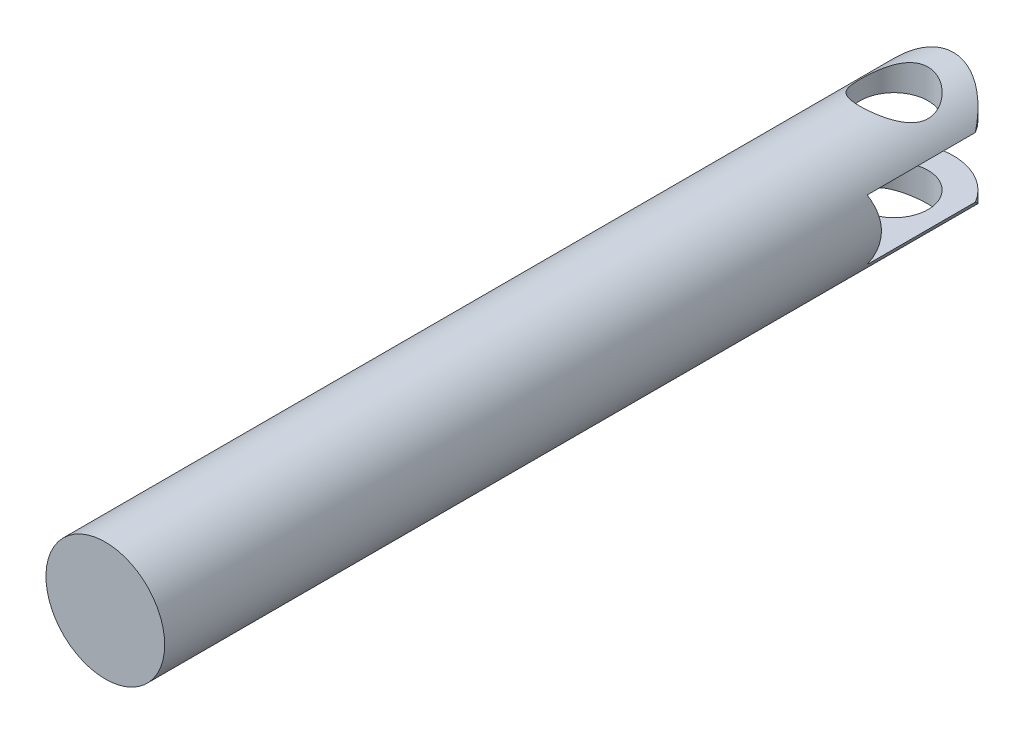
ISO-10303-21;
HEADER;
FILE_DESCRIPTION(('STEP AP214'),'2;1');
FILE_NAME('part.step','',(''),(''),'','','');
FILE_SCHEMA(('AUTOMOTIVE_DESIGN { 1 0 10303 214 1 1 1 1 }'));
ENDSEC;
DATA;
#1=APPLICATION_CONTEXT('core data for automotive mechanical design processes');
#2=APPLICATION_PROTOCOL_DEFINITION('international standard','automotive_design',2000,#1);
#3=PRODUCT_CONTEXT('',#1,'mechanical');
#4=PRODUCT('Part','Part','',(#3));
#5=PRODUCT_RELATED_PRODUCT_CATEGORY('part','',(#4));
#6=PRODUCT_DEFINITION_FORMATION('','',#4);
#7=PRODUCT_DEFINITION_CONTEXT('part definition',#1,'design');
#8=PRODUCT_DEFINITION('design','',#6,#7);
#9=PRODUCT_DEFINITION_SHAPE('','',#8);
#10=(LENGTH_UNIT() NAMED_UNIT(*) SI_UNIT(.MILLI.,.METRE.));
#11=(NAMED_UNIT(*) PLANE_ANGLE_UNIT() SI_UNIT($,.RADIAN.));
#12=(NAMED_UNIT(*) SI_UNIT($,.STERADIAN.) SOLID_ANGLE_UNIT());
#13=UNCERTAINTY_MEASURE_WITH_UNIT(LENGTH_MEASURE(1.E-05),#10,'distance_accuracy_value','');
#14=(GEOMETRIC_REPRESENTATION_CONTEXT(3) GLOBAL_UNCERTAINTY_ASSIGNED_CONTEXT((#13)) GLOBAL_UNIT_ASSIGNED_CONTEXT((#10,
#11,#12)) REPRESENTATION_CONTEXT('',''));
#15=CARTESIAN_POINT('',(0.,0.,0.));
#16=DIRECTION('',(0.,0.,1.));
#17=DIRECTION('',(1.,0.,0.));
#18=AXIS2_PLACEMENT_3D('',#15,#16,#17);
#19=CARTESIAN_POINT('',(0.,0.,100.));
#20=DIRECTION('',(0.,0.,-1.));
#21=DIRECTION('',(-1.,0.,0.));
#22=AXIS2_PLACEMENT_3D('',#19,#20,#21);
#23=CYLINDRICAL_SURFACE('',#22,7.);
#24=CARTESIAN_POINT('',(0.,-7.,11.01));
#25=CARTESIAN_POINT('',(0.10339422277203,-6.99999915490475,11.0099990606821));
#26=CARTESIAN_POINT('',(0.206819509013965,-6.99770306681074,11.0059946119519));
#27=CARTESIAN_POINT('',(0.412895896510924,-6.98857423742032,10.9900264503462));
#28=CARTESIAN_POINT('',(0.515546481284412,-6.98173870071603,10.9780578330995));
#29=CARTESIAN_POINT('',(0.719451117158006,-6.96368280476533,10.9462832091382));
#30=CARTESIAN_POINT('',(0.820702022515292,-6.95245384315522,10.9264618256769));
#31=CARTESIAN_POINT('',(1.02088525706655,-6.92589462898714,10.8792384189006));
#32=CARTESIAN_POINT('',(1.11981657821129,-6.91056262798031,10.8518331636622));
#33=CARTESIAN_POINT('',(1.41110752020608,-6.85910917687295,10.7590120418143));
#34=CARTESIAN_POINT('',(1.59917299541601,-6.81741679520293,10.682797926835));
#35=CARTESIAN_POINT('',(1.95923839934513,-6.72280876713762,10.5045596049174));
#36=CARTESIAN_POINT('',(2.13124264876945,-6.6698961517509,10.4025423669443));
#37=CARTESIAN_POINT('',(2.46853486559181,-6.55289468519645,10.1672864846148));
#38=CARTESIAN_POINT('',(2.63243314221602,-6.48827382698291,10.0323212106085));
#39=CARTESIAN_POINT('',(2.93661370542774,-6.35640279040988,9.73882402797849));
#40=CARTESIAN_POINT('',(3.0768677883393,-6.28914958822652,9.58026439347619));
#41=CARTESIAN_POINT('',(3.34529141750032,-6.15095126089987,9.22356832414636));
#42=CARTESIAN_POINT('',(3.47046225194872,-6.08040664798737,9.02300010893039));
#43=CARTESIAN_POINT('',(3.68477887626117,-5.95298539659239,8.59955768450985));
#44=CARTESIAN_POINT('',(3.77397940632616,-5.89608804336756,8.37671801826082));
#45=CARTESIAN_POINT('',(3.89648832700094,-5.8156261967934,7.96575766766011));
#46=CARTESIAN_POINT('',(3.93781282030795,-5.78746385411133,7.78092842520371));
#47=CARTESIAN_POINT('',(3.99393867809796,-5.74888383715326,7.40554464602105));
#48=CARTESIAN_POINT('',(4.00876868863763,-5.73844699851745,7.21499651961554));
#49=CARTESIAN_POINT('',(4.01108535441841,-5.73682821093372,6.83338960818927));
#50=CARTESIAN_POINT('',(3.99853394639673,-5.74567306570413,6.64233048153029));
#51=CARTESIAN_POINT('',(3.94675867786874,-5.78135278891646,6.26554993696892));
#52=CARTESIAN_POINT('',(3.90751637767286,-5.80820009436359,6.07983230180658));
#53=CARTESIAN_POINT('',(3.80452994791338,-5.87616304480329,5.7190902919182));
#54=CARTESIAN_POINT('',(3.74089100136453,-5.91721736513057,5.54402370009362));
#55=CARTESIAN_POINT('',(3.5913231225039,-6.00916666595751,5.206509256162));
#56=CARTESIAN_POINT('',(3.50538567846072,-6.06006540235207,5.04406625353967));
#57=CARTESIAN_POINT('',(3.29769841069949,-6.17587986838797,4.70866199713616));
#58=CARTESIAN_POINT('',(3.1724104337932,-6.24173300395297,4.53821770535939));
#59=CARTESIAN_POINT('',(2.89672203943336,-6.374353196614,4.21907011496009));
#60=CARTESIAN_POINT('',(2.74630007640611,-6.4411209923132,4.07038567641464));
#61=CARTESIAN_POINT('',(2.49437445829248,-6.54122019460662,3.85800438167936));
#62=CARTESIAN_POINT('',(2.40062015831315,-6.57629126704502,3.78578187780508));
#63=CARTESIAN_POINT('',(2.20649730699988,-6.64393825723827,3.64954991501123));
#64=CARTESIAN_POINT('',(2.10613145517799,-6.6765151817553,3.58553713511897));
#65=CARTESIAN_POINT('',(1.89930398153433,-6.73827095009801,3.46630577357821));
#66=CARTESIAN_POINT('',(1.79284216540309,-6.76744968551603,3.41108747246697));
#67=CARTESIAN_POINT('',(1.57455117673366,-6.82154078811034,3.3101034153821));
#68=CARTESIAN_POINT('',(1.46272531278859,-6.84645574298199,3.26433192262476));
#69=CARTESIAN_POINT('',(1.24230304302583,-6.88973312232274,3.18561575282503));
#70=CARTESIAN_POINT('',(1.13400862419864,-6.90842709502321,3.15200803066811));
#71=CARTESIAN_POINT('',(0.914320916944911,-6.94091751399438,3.09397713195957));
#72=CARTESIAN_POINT('',(0.802929336461923,-6.95471660399059,3.06954899708956));
#73=CARTESIAN_POINT('',(0.578014378075015,-6.97700958099427,3.03023616594795));
#74=CARTESIAN_POINT('',(0.464492271003925,-6.98550653316768,3.01534595566976));
#75=CARTESIAN_POINT('',(0.236316504527839,-6.9969420028122,2.99533197915777));
#76=CARTESIAN_POINT('',(0.121662974737821,-6.99988114971838,2.99020710697498));
#77=CARTESIAN_POINT('',(-0.0936232107450559,-7.00009772643698,2.98982972325072));
#78=CARTESIAN_POINT('',(-0.194255433725835,-6.998023721082,2.9934463044386));
#79=CARTESIAN_POINT('',(-0.394815898144512,-6.9895777518917,3.00821668297902));
#80=CARTESIAN_POINT('',(-0.494743909732402,-6.98320444498772,3.01937283563757));
#81=CARTESIAN_POINT('',(-0.693100062824907,-6.96631263283021,3.04908086480856));
#82=CARTESIAN_POINT('',(-0.791528774128059,-6.95579574531426,3.06762985504058));
#83=CARTESIAN_POINT('',(-0.986271026083983,-6.93086792483082,3.11189523080098));
#84=CARTESIAN_POINT('',(-1.08258373563265,-6.91645549035933,3.13761438012393));
#85=CARTESIAN_POINT('',(-1.36525924078058,-6.86820243886752,3.22446709062978));
#86=CARTESIAN_POINT('',(-1.54775511230006,-6.82912979981928,3.29566406792586));
#87=CARTESIAN_POINT('',(-1.89822120758769,-6.74014605650011,3.46239922617778));
#88=CARTESIAN_POINT('',(-2.06618795545145,-6.69023236862134,3.5579432103848));
#89=CARTESIAN_POINT('',(-2.40180770058298,-6.5776730331914,3.78189089067609));
#90=CARTESIAN_POINT('',(-2.56760643575879,-6.51424280257095,3.91268039655937));
#91=CARTESIAN_POINT('',(-2.87618247476918,-6.38401919282084,4.19787459929112));
#92=CARTESIAN_POINT('',(-3.0189329804026,-6.317222015622,4.35230638452663));
#93=CARTESIAN_POINT('',(-3.29374049282357,-6.17879392969487,4.70086489550501));
#94=CARTESIAN_POINT('',(-3.42278795740942,-6.10746458924374,4.89750275599001));
#95=CARTESIAN_POINT('',(-3.64570426607275,-5.97708825715025,5.31345803747138));
#96=CARTESIAN_POINT('',(-3.73961950995647,-5.91802511152271,5.53274505304236));
#97=CARTESIAN_POINT('',(-3.87198932670786,-5.83202821464702,5.94011559287066));
#98=CARTESIAN_POINT('',(-3.91800588922344,-5.80092616729374,6.12485730858766));
#99=CARTESIAN_POINT('',(-3.98339249397359,-5.75623193771265,6.50098702711298));
#100=CARTESIAN_POINT('',(-4.00279319368798,-5.74261961110047,6.6923671224296));
#101=CARTESIAN_POINT('',(-4.01388242754551,-5.73487628458108,7.07673866976633));
#102=CARTESIAN_POINT('',(-4.00551306786039,-5.740785983241,7.2697326503595));
#103=CARTESIAN_POINT('',(-3.96144763305538,-5.77127452469049,7.6511024301356));
#104=CARTESIAN_POINT('',(-3.92573431980416,-5.79586514419986,7.83947523870483));
#105=CARTESIAN_POINT('',(-3.8297627176397,-5.8597030128534,8.20323780898721));
#106=CARTESIAN_POINT('',(-3.76997561630966,-5.89866775970022,8.37880441455784));
#107=CARTESIAN_POINT('',(-3.62808562894618,-5.98698282534032,8.71782114304078));
#108=CARTESIAN_POINT('',(-3.54597455356914,-6.03633695387961,8.88126679143164));
#109=CARTESIAN_POINT('',(-3.34714426300905,-6.14911209394315,9.21825689586583));
#110=CARTESIAN_POINT('',(-3.22704117626925,-6.21352873084985,9.38947352075862));
#111=CARTESIAN_POINT('',(-2.96214477964389,-6.34409753197746,9.71095561311508));
#112=CARTESIAN_POINT('',(-2.81732985374759,-6.41025117236027,9.86120252692549));
#113=CARTESIAN_POINT('',(-2.4851725627203,-6.54675028575015,10.1558176386598));
#114=CARTESIAN_POINT('',(-2.29476860965261,-6.61656904913193,10.2970435968217));
#115=CARTESIAN_POINT('',(-1.99070876695479,-6.71181387593377,10.4830078876248));
#116=CARTESIAN_POINT('',(-1.88624212985324,-6.74199003029081,10.5406983776054));
#117=CARTESIAN_POINT('',(-1.67169043912192,-6.79836136300706,10.646896202529));
#118=CARTESIAN_POINT('',(-1.56160694241651,-6.82455763661813,10.6954060648607));
#119=CARTESIAN_POINT('',(-1.3566643432961,-6.86792592055508,10.7748382421832));
#120=CARTESIAN_POINT('',(-1.26258230643894,-6.88587425802628,10.8073541424068));
#121=CARTESIAN_POINT('',(-1.07169326140629,-6.91815260286331,10.8654261604258));
#122=CARTESIAN_POINT('',(-0.974886739237984,-6.93248325108001,10.8909835109474));
#123=CARTESIAN_POINT('',(-0.779392036648598,-6.95717139028924,10.934801180252));
#124=CARTESIAN_POINT('',(-0.680709035660352,-6.9675385100926,10.9530791876979));
#125=CARTESIAN_POINT('',(-0.481943976538681,-6.98410074785339,10.9821988781537));
#126=CARTESIAN_POINT('',(-0.381862735189229,-6.99029820539789,10.9930447313901));
#127=CARTESIAN_POINT('',(-0.234647357114613,-6.99622324796071,11.0034042191011));
#128=CARTESIAN_POINT('',(-0.187768256953036,-6.99763853006126,11.0058765443638));
#129=CARTESIAN_POINT('',(-0.0939282468051198,-6.99952715017047,11.0091747393046));
#130=CARTESIAN_POINT('',(-0.0469673283369137,-7.00000038388862,11.0100004266897));
#131=CARTESIAN_POINT('',(0.,-7.,11.01));
#132=B_SPLINE_CURVE_WITH_KNOTS('',3,(#24,#25,#26,#27,#28,#29,#30,#31,#32,#33,#34,#35,#36,#37,
#38,#39,#40,#41,#42,#43,#44,#45,#46,#47,#48,#49,#50,#51,#52,#53,#54,#55,#56,#57,#58,#59,#60,#61,
#62,#63,#64,#65,#66,#67,#68,#69,#70,#71,#72,#73,#74,#75,#76,#77,#78,#79,#80,#81,#82,#83,#84,#85,
#86,#87,#88,#89,#90,#91,#92,#93,#94,#95,#96,#97,#98,#99,#100,#101,#102,#103,#104,#105,#106,#107,
#108,#109,#110,#111,#112,#113,#114,#115,#116,#117,#118,#119,#120,#121,#122,#123,#124,#125,#126,
#127,#128,#129,#130,#131),.UNSPECIFIED.,.T.,.F.,(4,2,2,2,2,2,2,2,2,2,2,2,2,2,2,2,2,2,2,2,2,2,2,
2,2,2,2,2,2,2,2,2,2,2,2,2,2,2,2,2,2,2,2,2,2,2,2,2,2,2,2,2,2,4),(0.,0.310133634257097,
0.620458427174656,0.931393904189345,1.24246209327891,1.86095733878373,2.47928571774377,
3.14241678347418,3.80633334397143,4.54285213655744,5.27824581401167,5.85019188685847,
6.42151919171258,6.99364121203963,7.56615889102672,8.13623549933046,8.70653003692308,
9.36863811056312,10.0313167018104,10.4012158777616,10.7709649480745,11.1407258107439,
11.5102614629213,11.8545301286513,12.1986125707909,12.5424959141365,12.8863403095169,
13.1881256828158,13.4900053752235,13.7917673243063,14.0936457511264,14.6901902870958,
15.2868771461545,15.9457023877292,16.6052882140647,17.339074942203,18.0718890934378,
18.6481517061001,19.2237499918267,19.8005490134929,20.3777119595769,20.944088471665,
21.5106730347428,22.1646068796672,22.8191156954276,23.556334743082,23.9251889668221,
24.2939414983384,24.5970695876616,24.9001439420144,25.2024772709996,25.5046408197193,
25.645504937117,25.7863846481681),.UNSPECIFIED.);
#133=CARTESIAN_POINT('',(0.,-7.,11.01));
#134=VERTEX_POINT('',#133);
#135=EDGE_CURVE('E91',#134,#134,#132,.T.);
#136=ORIENTED_EDGE('',*,*,#135,.T.);
#137=EDGE_LOOP('',(#136));
#138=FACE_BOUND('',#137,.T.);
#139=CARTESIAN_POINT('',(0.,7.,11.01));
#140=CARTESIAN_POINT('',(-0.10339422277203,6.99999915490475,11.0099990606821));
#141=CARTESIAN_POINT('',(-0.206819509013965,6.99770306681074,11.0059946119519));
#142=CARTESIAN_POINT('',(-0.412895896510924,6.98857423742032,10.9900264503462));
#143=CARTESIAN_POINT('',(-0.515546481284412,6.98173870071603,10.9780578330995));
#144=CARTESIAN_POINT('',(-0.719451117158006,6.96368280476533,10.9462832091382));
#145=CARTESIAN_POINT('',(-0.820702022515292,6.95245384315522,10.9264618256769));
#146=CARTESIAN_POINT('',(-1.02088525706655,6.92589462898714,10.8792384189006));
#147=CARTESIAN_POINT('',(-1.11981657821129,6.91056262798031,10.8518331636622));
#148=CARTESIAN_POINT('',(-1.41110752020608,6.85910917687295,10.7590120418143));
#149=CARTESIAN_POINT('',(-1.59917299541601,6.81741679520293,10.682797926835));
#150=CARTESIAN_POINT('',(-1.95923839934513,6.72280876713762,10.5045596049174));
#151=CARTESIAN_POINT('',(-2.13124264876945,6.6698961517509,10.4025423669443));
#152=CARTESIAN_POINT('',(-2.46853486559181,6.55289468519645,10.1672864846148));
#153=CARTESIAN_POINT('',(-2.63243314221602,6.48827382698291,10.0323212106085));
#154=CARTESIAN_POINT('',(-2.93661370542774,6.35640279040988,9.73882402797849));
#155=CARTESIAN_POINT('',(-3.0768677883393,6.28914958822652,9.58026439347619));
#156=CARTESIAN_POINT('',(-3.34529141750032,6.15095126089987,9.22356832414636));
#157=CARTESIAN_POINT('',(-3.47046225194872,6.08040664798737,9.02300010893039));
#158=CARTESIAN_POINT('',(-3.68477887626117,5.95298539659239,8.59955768450985));
#159=CARTESIAN_POINT('',(-3.77397940632616,5.89608804336756,8.37671801826082));
#160=CARTESIAN_POINT('',(-3.89648832700094,5.8156261967934,7.96575766766011));
#161=CARTESIAN_POINT('',(-3.93781282030795,5.78746385411133,7.78092842520371));
#162=CARTESIAN_POINT('',(-3.99393867809796,5.74888383715326,7.40554464602105));
#163=CARTESIAN_POINT('',(-4.00876868863763,5.73844699851745,7.21499651961554));
#164=CARTESIAN_POINT('',(-4.01108535441841,5.73682821093372,6.83338960818927));
#165=CARTESIAN_POINT('',(-3.99853394639673,5.74567306570413,6.64233048153029));
#166=CARTESIAN_POINT('',(-3.94675867786874,5.78135278891646,6.26554993696892));
#167=CARTESIAN_POINT('',(-3.90751637767286,5.80820009436359,6.07983230180658));
#168=CARTESIAN_POINT('',(-3.80452994791338,5.87616304480329,5.7190902919182));
#169=CARTESIAN_POINT('',(-3.74089100136453,5.91721736513057,5.54402370009362));
#170=CARTESIAN_POINT('',(-3.5913231225039,6.00916666595751,5.206509256162));
#171=CARTESIAN_POINT('',(-3.50538567846072,6.06006540235207,5.04406625353967));
#172=CARTESIAN_POINT('',(-3.29769841069949,6.17587986838797,4.70866199713616));
#173=CARTESIAN_POINT('',(-3.1724104337932,6.24173300395297,4.53821770535939));
#174=CARTESIAN_POINT('',(-2.89672203943336,6.374353196614,4.21907011496009));
#175=CARTESIAN_POINT('',(-2.74630007640611,6.4411209923132,4.07038567641464));
#176=CARTESIAN_POINT('',(-2.49437445829248,6.54122019460662,3.85800438167936));
#177=CARTESIAN_POINT('',(-2.40062015831315,6.57629126704502,3.78578187780508));
#178=CARTESIAN_POINT('',(-2.20649730699988,6.64393825723827,3.64954991501123));
#179=CARTESIAN_POINT('',(-2.10613145517799,6.6765151817553,3.58553713511897));
#180=CARTESIAN_POINT('',(-1.89930398153433,6.73827095009801,3.46630577357821));
#181=CARTESIAN_POINT('',(-1.79284216540309,6.76744968551603,3.41108747246697));
#182=CARTESIAN_POINT('',(-1.57455117673366,6.82154078811034,3.3101034153821));
#183=CARTESIAN_POINT('',(-1.46272531278859,6.84645574298199,3.26433192262476));
#184=CARTESIAN_POINT('',(-1.24230304302583,6.88973312232274,3.18561575282503));
#185=CARTESIAN_POINT('',(-1.13400862419864,6.90842709502321,3.15200803066811));
#186=CARTESIAN_POINT('',(-0.914320916944911,6.94091751399438,3.09397713195957));
#187=CARTESIAN_POINT('',(-0.802929336461923,6.95471660399059,3.06954899708956));
#188=CARTESIAN_POINT('',(-0.578014378075015,6.97700958099427,3.03023616594795));
#189=CARTESIAN_POINT('',(-0.464492271003925,6.98550653316768,3.01534595566976));
#190=CARTESIAN_POINT('',(-0.236316504527839,6.9969420028122,2.99533197915777));
#191=CARTESIAN_POINT('',(-0.121662974737821,6.99988114971838,2.99020710697498));
#192=CARTESIAN_POINT('',(0.0936232107450559,7.00009772643698,2.98982972325072));
#193=CARTESIAN_POINT('',(0.194255433725835,6.998023721082,2.9934463044386));
#194=CARTESIAN_POINT('',(0.394815898144512,6.9895777518917,3.00821668297902));
#195=CARTESIAN_POINT('',(0.494743909732402,6.98320444498772,3.01937283563757));
#196=CARTESIAN_POINT('',(0.693100062824907,6.96631263283021,3.04908086480856));
#197=CARTESIAN_POINT('',(0.791528774128059,6.95579574531426,3.06762985504058));
#198=CARTESIAN_POINT('',(0.986271026083983,6.93086792483082,3.11189523080098));
#199=CARTESIAN_POINT('',(1.08258373563265,6.91645549035933,3.13761438012393));
#200=CARTESIAN_POINT('',(1.36525924078058,6.86820243886752,3.22446709062978));
#201=CARTESIAN_POINT('',(1.54775511230006,6.82912979981928,3.29566406792586));
#202=CARTESIAN_POINT('',(1.89822120758769,6.74014605650011,3.46239922617778));
#203=CARTESIAN_POINT('',(2.06618795545145,6.69023236862134,3.5579432103848));
#204=CARTESIAN_POINT('',(2.40180770058298,6.5776730331914,3.78189089067609));
#205=CARTESIAN_POINT('',(2.56760643575879,6.51424280257095,3.91268039655937));
#206=CARTESIAN_POINT('',(2.87618247476918,6.38401919282084,4.19787459929112));
#207=CARTESIAN_POINT('',(3.0189329804026,6.317222015622,4.35230638452663));
#208=CARTESIAN_POINT('',(3.29374049282357,6.17879392969487,4.70086489550501));
#209=CARTESIAN_POINT('',(3.42278795740942,6.10746458924374,4.89750275599001));
#210=CARTESIAN_POINT('',(3.64570426607275,5.97708825715025,5.31345803747138));
#211=CARTESIAN_POINT('',(3.73961950995647,5.91802511152271,5.53274505304236));
#212=CARTESIAN_POINT('',(3.87198932670786,5.83202821464702,5.94011559287066));
#213=CARTESIAN_POINT('',(3.91800588922344,5.80092616729374,6.12485730858766));
#214=CARTESIAN_POINT('',(3.98339249397359,5.75623193771265,6.50098702711298));
#215=CARTESIAN_POINT('',(4.00279319368798,5.74261961110047,6.6923671224296));
#216=CARTESIAN_POINT('',(4.01388242754551,5.73487628458108,7.07673866976633));
#217=CARTESIAN_POINT('',(4.00551306786039,5.740785983241,7.2697326503595));
#218=CARTESIAN_POINT('',(3.96144763305538,5.77127452469049,7.6511024301356));
#219=CARTESIAN_POINT('',(3.92573431980416,5.79586514419986,7.83947523870483));
#220=CARTESIAN_POINT('',(3.8297627176397,5.8597030128534,8.20323780898721));
#221=CARTESIAN_POINT('',(3.76997561630966,5.89866775970022,8.37880441455784));
#222=CARTESIAN_POINT('',(3.62808562894618,5.98698282534032,8.71782114304078));
#223=CARTESIAN_POINT('',(3.54597455356914,6.03633695387961,8.88126679143164));
#224=CARTESIAN_POINT('',(3.34714426300905,6.14911209394315,9.21825689586583));
#225=CARTESIAN_POINT('',(3.22704117626925,6.21352873084985,9.38947352075862));
#226=CARTESIAN_POINT('',(2.96214477964389,6.34409753197746,9.71095561311508));
#227=CARTESIAN_POINT('',(2.81732985374759,6.41025117236027,9.86120252692549));
#228=CARTESIAN_POINT('',(2.4851725627203,6.54675028575015,10.1558176386598));
#229=CARTESIAN_POINT('',(2.29476860965261,6.61656904913193,10.2970435968217));
#230=CARTESIAN_POINT('',(1.99070876695479,6.71181387593377,10.4830078876248));
#231=CARTESIAN_POINT('',(1.88624212985324,6.74199003029081,10.5406983776054));
#232=CARTESIAN_POINT('',(1.67169043912192,6.79836136300706,10.646896202529));
#233=CARTESIAN_POINT('',(1.56160694241651,6.82455763661813,10.6954060648607));
#234=CARTESIAN_POINT('',(1.3566643432961,6.86792592055508,10.7748382421832));
#235=CARTESIAN_POINT('',(1.26258230643894,6.88587425802628,10.8073541424068));
#236=CARTESIAN_POINT('',(1.07169326140629,6.91815260286331,10.8654261604258));
#237=CARTESIAN_POINT('',(0.974886739237984,6.93248325108001,10.8909835109474));
#238=CARTESIAN_POINT('',(0.779392036648598,6.95717139028924,10.934801180252));
#239=CARTESIAN_POINT('',(0.680709035660352,6.9675385100926,10.9530791876979));
#240=CARTESIAN_POINT('',(0.481943976538681,6.98410074785339,10.9821988781537));
#241=CARTESIAN_POINT('',(0.381862735189229,6.99029820539789,10.9930447313901));
#242=CARTESIAN_POINT('',(0.234647357114613,6.99622324796071,11.0034042191011));
#243=CARTESIAN_POINT('',(0.187768256953036,6.99763853006126,11.0058765443638));
#244=CARTESIAN_POINT('',(0.0939282468051198,6.99952715017047,11.0091747393046));
#245=CARTESIAN_POINT('',(0.0469673283369137,7.00000038388862,11.0100004266897));
#246=CARTESIAN_POINT('',(0.,7.,11.01));
#247=B_SPLINE_CURVE_WITH_KNOTS('',3,(#139,#140,#141,#142,#143,#144,#145,#146,#147,#148,#149,
#150,#151,#152,#153,#154,#155,#156,#157,#158,#159,#160,#161,#162,#163,#164,#165,#166,#167,#168,
#169,#170,#171,#172,#173,#174,#175,#176,#177,#178,#179,#180,#181,#182,#183,#184,#185,#186,#187,
#188,#189,#190,#191,#192,#193,#194,#195,#196,#197,#198,#199,#200,#201,#202,#203,#204,#205,#206,
#207,#208,#209,#210,#211,#212,#213,#214,#215,#216,#217,#218,#219,#220,#221,#222,#223,#224,#225,
#226,#227,#228,#229,#230,#231,#232,#233,#234,#235,#236,#237,#238,#239,#240,#241,#242,#243,#244,
#245,#246),.UNSPECIFIED.,.T.,.F.,(4,2,2,2,2,2,2,2,2,2,2,2,2,2,2,2,2,2,2,2,2,2,2,2,2,2,2,2,2,2,2,
2,2,2,2,2,2,2,2,2,2,2,2,2,2,2,2,2,2,2,2,2,2,4),(0.,0.310133634257097,0.620458427174656,
0.931393904189345,1.24246209327891,1.86095733878373,2.47928571774377,3.14241678347418,
3.80633334397143,4.54285213655744,5.27824581401167,5.85019188685847,6.42151919171258,
6.99364121203963,7.56615889102672,8.13623549933046,8.70653003692308,9.36863811056312,
10.0313167018104,10.4012158777616,10.7709649480745,11.1407258107439,11.5102614629213,
11.8545301286513,12.1986125707909,12.5424959141365,12.8863403095169,13.1881256828158,
13.4900053752235,13.7917673243063,14.0936457511264,14.6901902870958,15.2868771461545,
15.9457023877292,16.6052882140647,17.339074942203,18.0718890934378,18.6481517061001,
19.2237499918267,19.8005490134929,20.3777119595769,20.944088471665,21.5106730347428,
22.1646068796672,22.8191156954276,23.556334743082,23.9251889668221,24.2939414983384,
24.5970695876616,24.9001439420144,25.2024772709996,25.5046408197193,25.645504937117,
25.7863846481681),.UNSPECIFIED.);
#248=CARTESIAN_POINT('',(0.,7.,11.01));
#249=VERTEX_POINT('',#248);
#250=EDGE_CURVE('E146',#249,#249,#247,.T.);
#251=ORIENTED_EDGE('',*,*,#250,.T.);
#252=EDGE_LOOP('',(#251));
#253=FACE_BOUND('',#252,.T.);
#254=CARTESIAN_POINT('',(0.,0.,100.));
#255=DIRECTION('',(0.,0.,1.));
#256=DIRECTION('',(1.,0.,0.));
#257=AXIS2_PLACEMENT_3D('',#254,#255,#256);
#258=CIRCLE('',#257,7.);
#259=CARTESIAN_POINT('',(7.,0.,100.));
#260=VERTEX_POINT('',#259);
#261=EDGE_CURVE('E102',#260,#260,#258,.T.);
#262=ORIENTED_EDGE('',*,*,#261,.F.);
#263=EDGE_LOOP('',(#262));
#264=FACE_BOUND('',#263,.T.);
#265=DIRECTION('',(0.,0.,-1.));
#266=VECTOR('',#265,1.);
#267=CARTESIAN_POINT('',(6.03303406255923,-3.55,100.));
#268=LINE('',#267,#266);
#269=CARTESIAN_POINT('',(6.03303406255923,-3.55,16.1979617307314));
#270=VERTEX_POINT('',#269);
#271=CARTESIAN_POINT('',(6.03303406255924,-3.55,3.45));
#272=VERTEX_POINT('',#271);
#273=EDGE_CURVE('E58',#270,#272,#268,.T.);
#274=ORIENTED_EDGE('',*,*,#273,.F.);
#275=CARTESIAN_POINT('',(6.03303406255923,-3.55,16.1979617307314));
#276=CARTESIAN_POINT('',(6.11702957575485,-3.40724880263015,16.1428724182977));
#277=CARTESIAN_POINT('',(6.19623973289976,-3.26104781235698,16.089267074652));
#278=CARTESIAN_POINT('',(6.34463370903779,-2.96201360204328,15.9863101857787));
#279=CARTESIAN_POINT('',(6.41380754926322,-2.80917397492292,15.9369628936718));
#280=CARTESIAN_POINT('',(6.54197302515412,-2.49627144262936,15.8435812531352));
#281=CARTESIAN_POINT('',(6.60088635286948,-2.33616382242555,15.7995884761049));
#282=CARTESIAN_POINT('',(6.70726922871005,-2.01044347743437,15.7187731773768));
#283=CARTESIAN_POINT('',(6.75474096377491,-1.84483181158431,15.6819492856813));
#284=CARTESIAN_POINT('',(6.8379034542539,-1.50778195255008,15.6166060867518));
#285=CARTESIAN_POINT('',(6.87351018021311,-1.33631130452845,15.5881461748908));
#286=CARTESIAN_POINT('',(6.93188897820128,-0.989834451092231,15.5410964845965));
#287=CARTESIAN_POINT('',(6.95466049951405,-0.814828094305745,15.5225071296781));
#288=CARTESIAN_POINT('',(6.98684850482661,-0.463580038113813,15.4961393103621));
#289=CARTESIAN_POINT('',(6.9963253337604,-0.287347593545877,15.4883120000271));
#290=CARTESIAN_POINT('',(7.00191621535575,0.065461283180805,15.4837012445256));
#291=CARTESIAN_POINT('',(6.99803192860926,0.24203766986641,15.4869164269382));
#292=CARTESIAN_POINT('',(6.97820378774863,0.573586359135738,15.5032231044626));
#293=CARTESIAN_POINT('',(6.96369899691792,0.728706670344038,15.5151356116501));
#294=CARTESIAN_POINT('',(6.92452367839862,1.03687281630774,15.5470234233945));
#295=CARTESIAN_POINT('',(6.89984935234136,1.1899178538539,15.5670017405117));
#296=CARTESIAN_POINT('',(6.84060253201946,1.49336040719144,15.6143830114673));
#297=CARTESIAN_POINT('',(6.80600202478728,1.6437491331369,15.6418069659478));
#298=CARTESIAN_POINT('',(6.7273543517269,1.9406985501163,15.7031711312086));
#299=CARTESIAN_POINT('',(6.68330443175924,2.08725811109574,15.7371132414772));
#300=CARTESIAN_POINT('',(6.55635375856137,2.46468673662445,15.8331130075575));
#301=CARTESIAN_POINT('',(6.4662152575242,2.69200663477552,15.899628653111));
#302=CARTESIAN_POINT('',(6.26491087597459,3.13194640870477,16.0424567333448));
#303=CARTESIAN_POINT('',(6.15388954810585,3.34465437250946,16.1187007249173));
#304=CARTESIAN_POINT('',(6.03303406255923,3.55,16.1979617307314));
#305=B_SPLINE_CURVE_WITH_KNOTS('',3,(#275,#276,#277,#278,#279,#280,#281,#282,#283,#284,#285,
#286,#287,#288,#289,#290,#291,#292,#293,#294,#295,#296,#297,#298,#299,#300,#301,#302,#303,#304),
.UNSPECIFIED.,.F.,.F.,(4,2,2,2,2,2,2,2,2,2,2,2,2,2,4),(0.,0.523622513341592,1.0477621304742,
1.57574161974169,2.10362011112844,2.63516135982999,3.16672541347265,3.695868791095,
4.22494640628436,4.69314564908993,5.16151992519403,5.63122924104731,6.10107564551628,
6.85971602828546,7.61328638813762),.UNSPECIFIED.);
#306=CARTESIAN_POINT('',(6.03303406255923,3.55,16.1979617307314));
#307=VERTEX_POINT('',#306);
#308=EDGE_CURVE('E12',#270,#307,#305,.T.);
#309=ORIENTED_EDGE('',*,*,#308,.T.);
#310=DIRECTION('',(0.,0.,-1.));
#311=VECTOR('',#310,1.);
#312=CARTESIAN_POINT('',(6.03303406255923,3.55,100.));
#313=LINE('',#312,#311);
#314=CARTESIAN_POINT('',(6.03303406255924,3.55,3.45));
#315=VERTEX_POINT('',#314);
#316=EDGE_CURVE('E76',#307,#315,#313,.T.);
#317=ORIENTED_EDGE('',*,*,#316,.T.);
#318=CARTESIAN_POINT('',(0.,0.,7.));
#319=DIRECTION('',(0.,-0.707106781186547,-0.707106781186547));
#320=DIRECTION('',(0.,0.707106781186547,-0.707106781186547));
#321=AXIS2_PLACEMENT_3D('',#318,#319,#320);
#322=ELLIPSE('',#321,9.89949493661166,7.);
#323=CARTESIAN_POINT('',(-6.03303406255924,3.55,3.45));
#324=VERTEX_POINT('',#323);
#325=EDGE_CURVE('E98',#324,#315,#322,.T.);
#326=ORIENTED_EDGE('',*,*,#325,.F.);
#327=DIRECTION('',(0.,0.,-1.));
#328=VECTOR('',#327,1.);
#329=CARTESIAN_POINT('',(-6.03303406255923,3.55,100.));
#330=LINE('',#329,#328);
#331=CARTESIAN_POINT('',(-6.03303406255923,3.55,16.1979617307314));
#332=VERTEX_POINT('',#331);
#333=EDGE_CURVE('E50',#324,#332,#330,.F.);
#334=ORIENTED_EDGE('',*,*,#333,.T.);
#335=CARTESIAN_POINT('',(-6.03303406255923,3.55,16.1979617307314));
#336=CARTESIAN_POINT('',(-6.11702957575485,3.40724880263015,16.1428724182977));
#337=CARTESIAN_POINT('',(-6.19623973289976,3.26104781235698,16.089267074652));
#338=CARTESIAN_POINT('',(-6.34463370903779,2.96201360204328,15.9863101857787));
#339=CARTESIAN_POINT('',(-6.41380754926322,2.80917397492292,15.9369628936718));
#340=CARTESIAN_POINT('',(-6.54197302515412,2.49627144262936,15.8435812531352));
#341=CARTESIAN_POINT('',(-6.60088635286948,2.33616382242555,15.7995884761049));
#342=CARTESIAN_POINT('',(-6.70726922871005,2.01044347743437,15.7187731773768));
#343=CARTESIAN_POINT('',(-6.75474096377491,1.84483181158431,15.6819492856813));
#344=CARTESIAN_POINT('',(-6.8379034542539,1.50778195255008,15.6166060867518));
#345=CARTESIAN_POINT('',(-6.87351018021311,1.33631130452845,15.5881461748908));
#346=CARTESIAN_POINT('',(-6.93188897820128,0.989834451092231,15.5410964845965));
#347=CARTESIAN_POINT('',(-6.95466049951405,0.814828094305745,15.5225071296781));
#348=CARTESIAN_POINT('',(-6.98684850482661,0.463580038113813,15.4961393103621));
#349=CARTESIAN_POINT('',(-6.9963253337604,0.287347593545877,15.4883120000271));
#350=CARTESIAN_POINT('',(-7.00191621535575,-0.065461283180805,15.4837012445256));
#351=CARTESIAN_POINT('',(-6.99803192860926,-0.24203766986641,15.4869164269382));
#352=CARTESIAN_POINT('',(-6.97820378774863,-0.573586359135738,15.5032231044626));
#353=CARTESIAN_POINT('',(-6.96369899691792,-0.728706670344038,15.5151356116501));
#354=CARTESIAN_POINT('',(-6.92452367839862,-1.03687281630774,15.5470234233945));
#355=CARTESIAN_POINT('',(-6.89984935234136,-1.1899178538539,15.5670017405117));
#356=CARTESIAN_POINT('',(-6.84060253201946,-1.49336040719144,15.6143830114673));
#357=CARTESIAN_POINT('',(-6.80600202478728,-1.6437491331369,15.6418069659478));
#358=CARTESIAN_POINT('',(-6.7273543517269,-1.9406985501163,15.7031711312086));
#359=CARTESIAN_POINT('',(-6.68330443175924,-2.08725811109574,15.7371132414772));
#360=CARTESIAN_POINT('',(-6.55635375856137,-2.46468673662445,15.8331130075575));
#361=CARTESIAN_POINT('',(-6.4662152575242,-2.69200663477552,15.899628653111));
#362=CARTESIAN_POINT('',(-6.26491087597459,-3.13194640870477,16.0424567333448));
#363=CARTESIAN_POINT('',(-6.15388954810585,-3.34465437250946,16.1187007249173));
#364=CARTESIAN_POINT('',(-6.03303406255923,-3.55,16.1979617307314));
#365=B_SPLINE_CURVE_WITH_KNOTS('',3,(#335,#336,#337,#338,#339,#340,#341,#342,#343,#344,#345,
#346,#347,#348,#349,#350,#351,#352,#353,#354,#355,#356,#357,#358,#359,#360,#361,#362,#363,#364),
.UNSPECIFIED.,.F.,.F.,(4,2,2,2,2,2,2,2,2,2,2,2,2,2,4),(0.,0.523622513341592,1.0477621304742,
1.57574161974169,2.10362011112844,2.63516135982999,3.16672541347265,3.695868791095,
4.22494640628436,4.69314564908993,5.16151992519403,5.63122924104731,6.10107564551628,
6.85971602828546,7.61328638813762),.UNSPECIFIED.);
#366=CARTESIAN_POINT('',(-6.03303406255923,-3.55,16.1979617307314));
#367=VERTEX_POINT('',#366);
#368=EDGE_CURVE('E43',#332,#367,#365,.T.);
#369=ORIENTED_EDGE('',*,*,#368,.T.);
#370=DIRECTION('',(0.,0.,-1.));
#371=VECTOR('',#370,1.);
#372=CARTESIAN_POINT('',(-6.03303406255923,-3.55,100.));
#373=LINE('',#372,#371);
#374=CARTESIAN_POINT('',(-6.03303406255924,-3.55,3.45));
#375=VERTEX_POINT('',#374);
#376=EDGE_CURVE('E84',#375,#367,#373,.F.);
#377=ORIENTED_EDGE('',*,*,#376,.F.);
#378=CARTESIAN_POINT('',(0.,0.,7.));
#379=DIRECTION('',(0.,0.707106781186547,-0.707106781186547));
#380=DIRECTION('',(0.,-0.707106781186547,-0.707106781186547));
#381=AXIS2_PLACEMENT_3D('',#378,#379,#380);
#382=ELLIPSE('',#381,9.89949493661166,7.);
#383=EDGE_CURVE('E96',#272,#375,#382,.T.);
#384=ORIENTED_EDGE('',*,*,#383,.F.);
#385=EDGE_LOOP('',(#274,#309,#317,#326,#334,#369,#377,#384));
#386=FACE_BOUND('',#385,.T.);
#387=ADVANCED_FACE('F34',(#138,#253,#264,#386),#23,.T.);
#388=CARTESIAN_POINT('',(0.,-8.,7.));
#389=DIRECTION('',(0.,1.,0.));
#390=DIRECTION('',(0.,0.,1.));
#391=AXIS2_PLACEMENT_3D('',#388,#389,#390);
#392=CYLINDRICAL_SURFACE('',#391,7.);
#393=ORIENTED_EDGE('',*,*,#383,.T.);
#394=CARTESIAN_POINT('',(0.,-3.55,7.));
#395=DIRECTION('',(0.,1.,0.));
#396=DIRECTION('',(0.,0.,1.));
#397=AXIS2_PLACEMENT_3D('',#394,#395,#396);
#398=CIRCLE('',#397,7.);
#399=EDGE_CURVE('E107',#375,#272,#398,.F.);
#400=ORIENTED_EDGE('',*,*,#399,.T.);
#401=EDGE_LOOP('',(#393,#400));
#402=FACE_BOUND('',#401,.T.);
#403=ADVANCED_FACE('F129',(#402),#392,.T.);
#404=CARTESIAN_POINT('',(0.,0.,100.));
#405=DIRECTION('',(0.,0.,1.));
#406=DIRECTION('',(1.,0.,0.));
#407=AXIS2_PLACEMENT_3D('',#404,#405,#406);
#408=PLANE('',#407);
#409=ORIENTED_EDGE('',*,*,#261,.T.);
#410=EDGE_LOOP('',(#409));
#411=FACE_BOUND('',#410,.T.);
#412=ADVANCED_FACE('F127',(#411),#408,.T.);
#413=CARTESIAN_POINT('',(0.,3.55,7.));
#414=DIRECTION('',(0.,1.,0.));
#415=DIRECTION('',(0.,0.,1.));
#416=AXIS2_PLACEMENT_3D('',#413,#414,#415);
#417=CIRCLE('',#416,7.);
#418=EDGE_CURVE('E80',#324,#315,#417,.F.);
#419=ORIENTED_EDGE('',*,*,#418,.F.);
#420=ORIENTED_EDGE('',*,*,#325,.T.);
#421=EDGE_LOOP('',(#419,#420));
#422=FACE_BOUND('',#421,.T.);
#423=ADVANCED_FACE('F123',(#422),#392,.T.);
#424=CARTESIAN_POINT('',(0.,-3.55,7.));
#425=DIRECTION('',(0.,1.,0.));
#426=DIRECTION('',(0.,0.,1.));
#427=AXIS2_PLACEMENT_3D('',#424,#425,#426);
#428=CYLINDRICAL_SURFACE('',#427,11.);
#429=CARTESIAN_POINT('',(0.,-3.55,7.));
#430=DIRECTION('',(0.,1.,0.));
#431=DIRECTION('',(0.,0.,1.));
#432=AXIS2_PLACEMENT_3D('',#429,#430,#431);
#433=CIRCLE('',#432,11.);
#434=EDGE_CURVE('E90',#367,#270,#433,.T.);
#435=ORIENTED_EDGE('',*,*,#434,.F.);
#436=ORIENTED_EDGE('',*,*,#368,.F.);
#437=CARTESIAN_POINT('',(0.,3.55,7.));
#438=DIRECTION('',(0.,1.,0.));
#439=DIRECTION('',(0.,0.,1.));
#440=AXIS2_PLACEMENT_3D('',#437,#438,#439);
#441=CIRCLE('',#440,11.);
#442=EDGE_CURVE('E79',#332,#307,#441,.T.);
#443=ORIENTED_EDGE('',*,*,#442,.T.);
#444=ORIENTED_EDGE('',*,*,#308,.F.);
#445=EDGE_LOOP('',(#435,#436,#443,#444));
#446=FACE_BOUND('',#445,.T.);
#447=ADVANCED_FACE('F88',(#446),#428,.F.);
#448=CARTESIAN_POINT('',(0.,-3.55,7.));
#449=DIRECTION('',(0.,1.,0.));
#450=DIRECTION('',(0.,0.,1.));
#451=AXIS2_PLACEMENT_3D('',#448,#449,#450);
#452=PLANE('',#451);
#453=CARTESIAN_POINT('',(0.,-3.55,7.));
#454=DIRECTION('',(0.,1.,0.));
#455=DIRECTION('',(0.,0.,1.));
#456=AXIS2_PLACEMENT_3D('',#453,#454,#455);
#457=CIRCLE('',#456,4.01);
#458=CARTESIAN_POINT('',(0.,-3.55,11.01));
#459=VERTEX_POINT('',#458);
#460=EDGE_CURVE('E149',#459,#459,#457,.T.);
#461=ORIENTED_EDGE('',*,*,#460,.F.);
#462=EDGE_LOOP('',(#461));
#463=FACE_BOUND('',#462,.T.);
#464=ORIENTED_EDGE('',*,*,#273,.T.);
#465=ORIENTED_EDGE('',*,*,#399,.F.);
#466=ORIENTED_EDGE('',*,*,#376,.T.);
#467=ORIENTED_EDGE('',*,*,#434,.T.);
#468=EDGE_LOOP('',(#464,#465,#466,#467));
#469=FACE_BOUND('',#468,.T.);
#470=ADVANCED_FACE('F122',(#463,#469),#452,.T.);
#471=CARTESIAN_POINT('',(0.,3.55,7.));
#472=DIRECTION('',(0.,1.,0.));
#473=DIRECTION('',(0.,0.,1.));
#474=AXIS2_PLACEMENT_3D('',#471,#472,#473);
#475=PLANE('',#474);
#476=CARTESIAN_POINT('',(0.,3.55,7.));
#477=DIRECTION('',(0.,1.,0.));
#478=DIRECTION('',(0.,0.,1.));
#479=AXIS2_PLACEMENT_3D('',#476,#477,#478);
#480=CIRCLE('',#479,4.01);
#481=CARTESIAN_POINT('',(0.,3.55,11.01));
#482=VERTEX_POINT('',#481);
#483=EDGE_CURVE('E38',#482,#482,#480,.T.);
#484=ORIENTED_EDGE('',*,*,#483,.T.);
#485=EDGE_LOOP('',(#484));
#486=FACE_BOUND('',#485,.T.);
#487=ORIENTED_EDGE('',*,*,#442,.F.);
#488=ORIENTED_EDGE('',*,*,#333,.F.);
#489=ORIENTED_EDGE('',*,*,#418,.T.);
#490=ORIENTED_EDGE('',*,*,#316,.F.);
#491=EDGE_LOOP('',(#487,#488,#489,#490));
#492=FACE_BOUND('',#491,.T.);
#493=ADVANCED_FACE('F78',(#486,#492),#475,.F.);
#494=CARTESIAN_POINT('',(0.,-80.,7.));
#495=DIRECTION('',(0.,1.,0.));
#496=DIRECTION('',(0.,0.,1.));
#497=AXIS2_PLACEMENT_3D('',#494,#495,#496);
#498=CYLINDRICAL_SURFACE('',#497,4.01);
#499=ORIENTED_EDGE('',*,*,#483,.F.);
#500=EDGE_LOOP('',(#499));
#501=FACE_BOUND('',#500,.T.);
#502=ORIENTED_EDGE('',*,*,#250,.F.);
#503=EDGE_LOOP('',(#502));
#504=FACE_BOUND('',#503,.T.);
#505=ADVANCED_FACE('F165',(#501,#504),#498,.F.);
#506=ORIENTED_EDGE('',*,*,#460,.T.);
#507=EDGE_LOOP('',(#506));
#508=FACE_BOUND('',#507,.T.);
#509=ORIENTED_EDGE('',*,*,#135,.F.);
#510=EDGE_LOOP('',(#509));
#511=FACE_BOUND('',#510,.T.);
#512=ADVANCED_FACE('F162',(#508,#511),#498,.F.);
#513=CLOSED_SHELL('',(#387,#403,#412,#423,#447,#470,#493,#505,#512));
#514=MANIFOLD_SOLID_BREP('B2',#513);
#515=ADVANCED_BREP_SHAPE_REPRESENTATION('',(#18,#514),#14);
#516=SHAPE_DEFINITION_REPRESENTATION(#9,#515);
ENDSEC;
END-ISO-10303-21;
